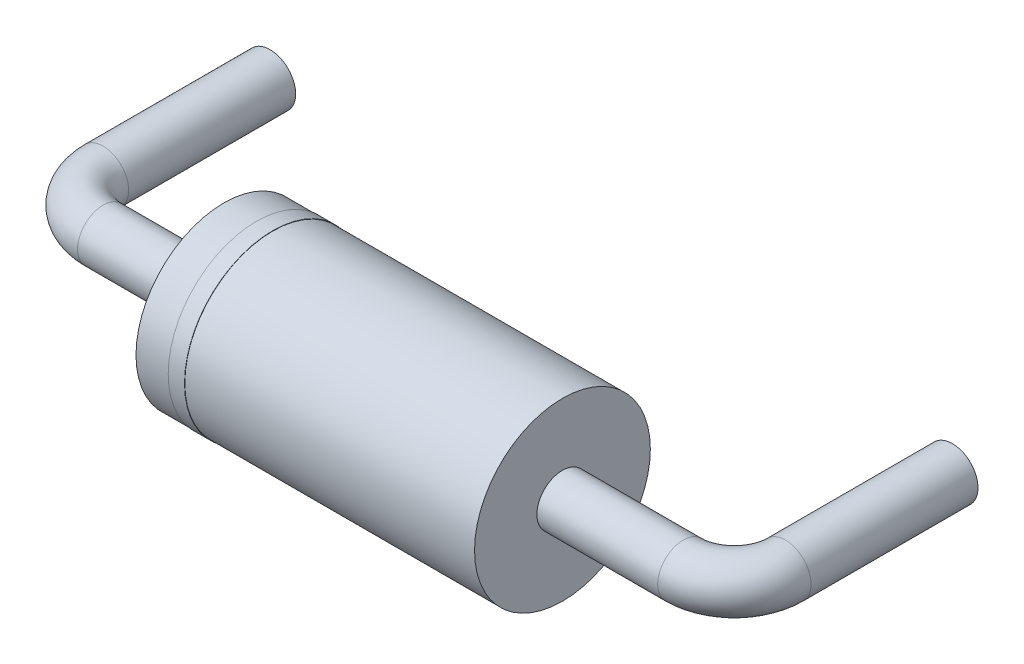
ISO-10303-21;
HEADER;
FILE_DESCRIPTION(('STEP AP214'),'2;1');
FILE_NAME('part.step','',(''),(''),'','','');
FILE_SCHEMA(('AUTOMOTIVE_DESIGN { 1 0 10303 214 1 1 1 1 }'));
ENDSEC;
DATA;
#1=APPLICATION_CONTEXT('core data for automotive mechanical design processes');
#2=APPLICATION_PROTOCOL_DEFINITION('international standard','automotive_design',2000,#1);
#3=PRODUCT_CONTEXT('',#1,'mechanical');
#4=PRODUCT('Part','Part','',(#3));
#5=PRODUCT_RELATED_PRODUCT_CATEGORY('part','',(#4));
#6=PRODUCT_DEFINITION_FORMATION('','',#4);
#7=PRODUCT_DEFINITION_CONTEXT('part definition',#1,'design');
#8=PRODUCT_DEFINITION('design','',#6,#7);
#9=PRODUCT_DEFINITION_SHAPE('','',#8);
#10=(LENGTH_UNIT() NAMED_UNIT(*) SI_UNIT(.MILLI.,.METRE.));
#11=(NAMED_UNIT(*) PLANE_ANGLE_UNIT() SI_UNIT($,.RADIAN.));
#12=(NAMED_UNIT(*) SI_UNIT($,.STERADIAN.) SOLID_ANGLE_UNIT());
#13=UNCERTAINTY_MEASURE_WITH_UNIT(LENGTH_MEASURE(1.E-05),#10,'distance_accuracy_value','');
#14=(GEOMETRIC_REPRESENTATION_CONTEXT(3) GLOBAL_UNCERTAINTY_ASSIGNED_CONTEXT((#13)) GLOBAL_UNIT_ASSIGNED_CONTEXT((#10,
#11,#12)) REPRESENTATION_CONTEXT('',''));
#15=CARTESIAN_POINT('',(0.,0.,0.));
#16=DIRECTION('',(0.,0.,1.));
#17=DIRECTION('',(1.,0.,0.));
#18=AXIS2_PLACEMENT_3D('',#15,#16,#17);
#19=CARTESIAN_POINT('',(-5.6325,0.,-2.));
#20=DIRECTION('',(0.,0.,1.));
#21=DIRECTION('',(1.,0.,0.));
#22=AXIS2_PLACEMENT_3D('',#19,#20,#21);
#23=PLANE('',#22);
#24=CARTESIAN_POINT('',(-5.24,0.,-2.));
#25=DIRECTION('',(0.,0.,-1.));
#26=DIRECTION('',(-1.,0.,0.));
#27=AXIS2_PLACEMENT_3D('',#24,#25,#26);
#28=CIRCLE('',#27,0.3925);
#29=CARTESIAN_POINT('',(-5.6325,0.,-2.));
#30=VERTEX_POINT('',#29);
#31=EDGE_CURVE('P0_E11',#30,#30,#28,.T.);
#32=ORIENTED_EDGE('',*,*,#31,.T.);
#33=EDGE_LOOP('',(#32));
#34=FACE_BOUND('',#33,.T.);
#35=ADVANCED_FACE('P0_F16',(#34),#23,.F.);
#36=CARTESIAN_POINT('',(-5.24,0.,0.565));
#37=DIRECTION('',(0.,0.,-1.));
#38=DIRECTION('',(-1.,0.,0.));
#39=AXIS2_PLACEMENT_3D('',#36,#37,#38);
#40=CYLINDRICAL_SURFACE('',#39,0.3925);
#41=DIRECTION('',(0.,0.,-1.));
#42=VECTOR('',#41,1.);
#43=CARTESIAN_POINT('',(-5.6325,0.,0.565));
#44=LINE('',#43,#42);
#45=CARTESIAN_POINT('',(-5.6325,0.,0.565));
#46=VERTEX_POINT('',#45);
#47=EDGE_CURVE('P0_E24',#46,#30,#44,.T.);
#48=ORIENTED_EDGE('',*,*,#47,.T.);
#49=ORIENTED_EDGE('',*,*,#31,.F.);
#50=ORIENTED_EDGE('',*,*,#47,.F.);
#51=CARTESIAN_POINT('',(-5.24,0.,0.565));
#52=DIRECTION('',(0.,0.,1.));
#53=DIRECTION('',(-1.,0.,0.));
#54=AXIS2_PLACEMENT_3D('',#51,#52,#53);
#55=CIRCLE('',#54,0.3925);
#56=EDGE_CURVE('P0_E68',#46,#46,#55,.T.);
#57=ORIENTED_EDGE('',*,*,#56,.F.);
#58=EDGE_LOOP('',(#48,#49,#50,#57));
#59=FACE_BOUND('',#58,.T.);
#60=ADVANCED_FACE('P0_F75',(#59),#40,.T.);
#61=CARTESIAN_POINT('',(-4.455,0.,0.565));
#62=DIRECTION('',(0.,-1.,0.));
#63=DIRECTION('',(0.,0.,1.));
#64=AXIS2_PLACEMENT_3D('',#61,#62,#63);
#65=TOROIDAL_SURFACE('',#64,0.785,0.3925);
#66=CARTESIAN_POINT('',(-4.455,0.,0.565));
#67=DIRECTION('',(0.,-1.,0.));
#68=DIRECTION('',(0.,0.,1.));
#69=AXIS2_PLACEMENT_3D('',#66,#67,#68);
#70=CIRCLE('',#69,1.1775);
#71=CARTESIAN_POINT('',(-4.455,0.,1.7425));
#72=VERTEX_POINT('',#71);
#73=EDGE_CURVE('P0_E63',#72,#46,#70,.T.);
#74=ORIENTED_EDGE('',*,*,#73,.T.);
#75=ORIENTED_EDGE('',*,*,#56,.T.);
#76=ORIENTED_EDGE('',*,*,#73,.F.);
#77=CARTESIAN_POINT('',(-4.455,0.,1.35));
#78=DIRECTION('',(-1.,0.,0.));
#79=DIRECTION('',(0.,0.,1.));
#80=AXIS2_PLACEMENT_3D('',#77,#78,#79);
#81=CIRCLE('',#80,0.3925);
#82=EDGE_CURVE('P0_E57',#72,#72,#81,.T.);
#83=ORIENTED_EDGE('',*,*,#82,.T.);
#84=EDGE_LOOP('',(#74,#75,#76,#83));
#85=FACE_BOUND('',#84,.T.);
#86=ADVANCED_FACE('P0_F74',(#85),#65,.T.);
#87=CARTESIAN_POINT('',(-2.6,0.,1.35));
#88=DIRECTION('',(-1.,0.,0.));
#89=DIRECTION('',(0.,0.,1.));
#90=AXIS2_PLACEMENT_3D('',#87,#88,#89);
#91=CYLINDRICAL_SURFACE('',#90,0.3925);
#92=DIRECTION('',(-1.,0.,0.));
#93=VECTOR('',#92,1.);
#94=CARTESIAN_POINT('',(-2.6,0.,1.7425));
#95=LINE('',#94,#93);
#96=CARTESIAN_POINT('',(-2.6,0.,1.7425));
#97=VERTEX_POINT('',#96);
#98=EDGE_CURVE('P0_E52',#97,#72,#95,.T.);
#99=ORIENTED_EDGE('',*,*,#98,.T.);
#100=ORIENTED_EDGE('',*,*,#82,.F.);
#101=ORIENTED_EDGE('',*,*,#98,.F.);
#102=CARTESIAN_POINT('',(-2.6,0.,1.35));
#103=DIRECTION('',(-1.,0.,0.));
#104=DIRECTION('',(0.,0.,1.));
#105=AXIS2_PLACEMENT_3D('',#102,#103,#104);
#106=CIRCLE('',#105,0.3925);
#107=EDGE_CURVE('P0_E55',#97,#97,#106,.T.);
#108=ORIENTED_EDGE('',*,*,#107,.T.);
#109=EDGE_LOOP('',(#99,#100,#101,#108));
#110=FACE_BOUND('',#109,.T.);
#111=ADVANCED_FACE('P0_F53',(#110),#91,.T.);
#112=CARTESIAN_POINT('',(-2.6,0.,1.7425));
#113=DIRECTION('',(1.,0.,0.));
#114=DIRECTION('',(0.,1.,0.));
#115=AXIS2_PLACEMENT_3D('',#112,#113,#114);
#116=PLANE('',#115);
#117=ORIENTED_EDGE('',*,*,#107,.F.);
#118=EDGE_LOOP('',(#117));
#119=FACE_BOUND('',#118,.T.);
#120=ADVANCED_FACE('P0_F90',(#119),#116,.T.);
#121=CLOSED_SHELL('',(#35,#60,#86,#111,#120));
#122=MANIFOLD_SOLID_BREP('P0_B1',#121);
#123=CARTESIAN_POINT('',(5.6325,0.,-2.));
#124=DIRECTION('',(0.,0.,1.));
#125=DIRECTION('',(1.,0.,0.));
#126=AXIS2_PLACEMENT_3D('',#123,#124,#125);
#127=PLANE('',#126);
#128=CARTESIAN_POINT('',(5.24,0.,-2.));
#129=DIRECTION('',(0.,0.,-1.));
#130=DIRECTION('',(1.,0.,0.));
#131=AXIS2_PLACEMENT_3D('',#128,#129,#130);
#132=CIRCLE('',#131,0.3925);
#133=CARTESIAN_POINT('',(5.6325,0.,-2.));
#134=VERTEX_POINT('',#133);
#135=EDGE_CURVE('P1_E11',#134,#134,#132,.T.);
#136=ORIENTED_EDGE('',*,*,#135,.T.);
#137=EDGE_LOOP('',(#136));
#138=FACE_BOUND('',#137,.T.);
#139=ADVANCED_FACE('P1_F16',(#138),#127,.F.);
#140=CARTESIAN_POINT('',(5.24,0.,0.565));
#141=DIRECTION('',(0.,0.,-1.));
#142=DIRECTION('',(1.,0.,0.));
#143=AXIS2_PLACEMENT_3D('',#140,#141,#142);
#144=CYLINDRICAL_SURFACE('',#143,0.3925);
#145=DIRECTION('',(0.,0.,-1.));
#146=VECTOR('',#145,1.);
#147=CARTESIAN_POINT('',(5.6325,0.,0.565));
#148=LINE('',#147,#146);
#149=CARTESIAN_POINT('',(5.6325,0.,0.565));
#150=VERTEX_POINT('',#149);
#151=EDGE_CURVE('P1_E27',#150,#134,#148,.T.);
#152=ORIENTED_EDGE('',*,*,#151,.T.);
#153=ORIENTED_EDGE('',*,*,#135,.F.);
#154=ORIENTED_EDGE('',*,*,#151,.F.);
#155=CARTESIAN_POINT('',(5.24,0.,0.565));
#156=DIRECTION('',(0.,0.,1.));
#157=DIRECTION('',(1.,0.,0.));
#158=AXIS2_PLACEMENT_3D('',#155,#156,#157);
#159=CIRCLE('',#158,0.3925);
#160=EDGE_CURVE('P1_E20',#150,#150,#159,.T.);
#161=ORIENTED_EDGE('',*,*,#160,.F.);
#162=EDGE_LOOP('',(#152,#153,#154,#161));
#163=FACE_BOUND('',#162,.T.);
#164=ADVANCED_FACE('P1_F69',(#163),#144,.T.);
#165=CARTESIAN_POINT('',(4.455,0.,0.565));
#166=DIRECTION('',(0.,1.,0.));
#167=DIRECTION('',(0.,0.,1.));
#168=AXIS2_PLACEMENT_3D('',#165,#166,#167);
#169=TOROIDAL_SURFACE('',#168,0.785,0.3925);
#170=CARTESIAN_POINT('',(4.455,0.,0.565));
#171=DIRECTION('',(0.,1.,0.));
#172=DIRECTION('',(0.,0.,1.));
#173=AXIS2_PLACEMENT_3D('',#170,#171,#172);
#174=CIRCLE('',#173,1.1775);
#175=CARTESIAN_POINT('',(4.455,0.,1.7425));
#176=VERTEX_POINT('',#175);
#177=EDGE_CURVE('P1_E50',#176,#150,#174,.T.);
#178=ORIENTED_EDGE('',*,*,#177,.T.);
#179=ORIENTED_EDGE('',*,*,#160,.T.);
#180=ORIENTED_EDGE('',*,*,#177,.F.);
#181=CARTESIAN_POINT('',(4.455,0.,1.35));
#182=DIRECTION('',(1.,0.,0.));
#183=DIRECTION('',(0.,0.,1.));
#184=AXIS2_PLACEMENT_3D('',#181,#182,#183);
#185=CIRCLE('',#184,0.3925);
#186=EDGE_CURVE('P1_E53',#176,#176,#185,.T.);
#187=ORIENTED_EDGE('',*,*,#186,.T.);
#188=EDGE_LOOP('',(#178,#179,#180,#187));
#189=FACE_BOUND('',#188,.T.);
#190=ADVANCED_FACE('P1_F51',(#189),#169,.T.);
#191=CARTESIAN_POINT('',(2.6,0.,1.35));
#192=DIRECTION('',(1.,0.,0.));
#193=DIRECTION('',(0.,0.,1.));
#194=AXIS2_PLACEMENT_3D('',#191,#192,#193);
#195=CYLINDRICAL_SURFACE('',#194,0.3925);
#196=DIRECTION('',(1.,0.,0.));
#197=VECTOR('',#196,1.);
#198=CARTESIAN_POINT('',(2.6,0.,1.7425));
#199=LINE('',#198,#197);
#200=CARTESIAN_POINT('',(2.6,0.,1.7425));
#201=VERTEX_POINT('',#200);
#202=EDGE_CURVE('P1_E62',#201,#176,#199,.T.);
#203=ORIENTED_EDGE('',*,*,#202,.T.);
#204=ORIENTED_EDGE('',*,*,#186,.F.);
#205=ORIENTED_EDGE('',*,*,#202,.F.);
#206=CARTESIAN_POINT('',(2.6,0.,1.35));
#207=DIRECTION('',(1.,0.,0.));
#208=DIRECTION('',(0.,0.,1.));
#209=AXIS2_PLACEMENT_3D('',#206,#207,#208);
#210=CIRCLE('',#209,0.3925);
#211=EDGE_CURVE('P1_E65',#201,#201,#210,.T.);
#212=ORIENTED_EDGE('',*,*,#211,.T.);
#213=EDGE_LOOP('',(#203,#204,#205,#212));
#214=FACE_BOUND('',#213,.T.);
#215=ADVANCED_FACE('P1_F77',(#214),#195,.T.);
#216=CARTESIAN_POINT('',(2.6,0.,1.7425));
#217=DIRECTION('',(-1.,0.,0.));
#218=DIRECTION('',(0.,0.,1.));
#219=AXIS2_PLACEMENT_3D('',#216,#217,#218);
#220=PLANE('',#219);
#221=ORIENTED_EDGE('',*,*,#211,.F.);
#222=EDGE_LOOP('',(#221));
#223=FACE_BOUND('',#222,.T.);
#224=ADVANCED_FACE('P1_F18',(#223),#220,.T.);
#225=CLOSED_SHELL('',(#139,#164,#190,#215,#224));
#226=MANIFOLD_SOLID_BREP('P1_B1',#225);
#227=CARTESIAN_POINT('',(-2.6,0.,1.35));
#228=DIRECTION('',(1.,0.,0.));
#229=DIRECTION('',(0.,1.,0.));
#230=AXIS2_PLACEMENT_3D('',#227,#228,#229);
#231=PLANE('',#230);
#232=CARTESIAN_POINT('',(-2.6,0.,1.35));
#233=DIRECTION('',(1.,0.,0.));
#234=DIRECTION('',(0.,0.,1.));
#235=AXIS2_PLACEMENT_3D('',#232,#233,#234);
#236=CIRCLE('',#235,1.35);
#237=CARTESIAN_POINT('',(-2.6,0.,2.7));
#238=VERTEX_POINT('',#237);
#239=EDGE_CURVE('P2_E11',#238,#238,#236,.T.);
#240=ORIENTED_EDGE('',*,*,#239,.F.);
#241=EDGE_LOOP('',(#240));
#242=FACE_BOUND('',#241,.T.);
#243=ADVANCED_FACE('P2_F16',(#242),#231,.F.);
#244=CARTESIAN_POINT('',(2.6,0.,1.35));
#245=DIRECTION('',(1.,0.,0.));
#246=DIRECTION('',(0.,1.,0.));
#247=AXIS2_PLACEMENT_3D('',#244,#245,#246);
#248=PLANE('',#247);
#249=CARTESIAN_POINT('',(2.6,0.,1.35));
#250=DIRECTION('',(1.,0.,0.));
#251=DIRECTION('',(0.,0.,1.));
#252=AXIS2_PLACEMENT_3D('',#249,#250,#251);
#253=CIRCLE('',#252,1.35);
#254=CARTESIAN_POINT('',(2.6,0.,2.7));
#255=VERTEX_POINT('',#254);
#256=EDGE_CURVE('P2_E40',#255,#255,#253,.T.);
#257=ORIENTED_EDGE('',*,*,#256,.T.);
#258=EDGE_LOOP('',(#257));
#259=FACE_BOUND('',#258,.T.);
#260=ADVANCED_FACE('P2_F43',(#259),#248,.T.);
#261=CARTESIAN_POINT('',(-2.6,0.,1.35));
#262=DIRECTION('',(1.,0.,0.));
#263=DIRECTION('',(0.,0.,1.));
#264=AXIS2_PLACEMENT_3D('',#261,#262,#263);
#265=CYLINDRICAL_SURFACE('',#264,1.35);
#266=ORIENTED_EDGE('',*,*,#256,.F.);
#267=DIRECTION('',(1.,0.,0.));
#268=VECTOR('',#267,1.);
#269=CARTESIAN_POINT('',(-2.6,0.,2.7));
#270=LINE('',#269,#268);
#271=EDGE_CURVE('P2_E19',#238,#255,#270,.T.);
#272=ORIENTED_EDGE('',*,*,#271,.F.);
#273=ORIENTED_EDGE('',*,*,#239,.T.);
#274=ORIENTED_EDGE('',*,*,#271,.T.);
#275=EDGE_LOOP('',(#266,#272,#273,#274));
#276=FACE_BOUND('',#275,.T.);
#277=ADVANCED_FACE('P2_F39',(#276),#265,.T.);
#278=CLOSED_SHELL('',(#243,#260,#277));
#279=MANIFOLD_SOLID_BREP('P2_B1',#278);
#280=CARTESIAN_POINT('',(-1.85,0.,1.35));
#281=DIRECTION('',(-1.,0.,0.));
#282=DIRECTION('',(0.,0.,1.));
#283=AXIS2_PLACEMENT_3D('',#280,#281,#282);
#284=CYLINDRICAL_SURFACE('',#283,1.355);
#285=DIRECTION('',(-1.,0.,0.));
#286=VECTOR('',#285,1.);
#287=CARTESIAN_POINT('',(-1.85,0.,2.705));
#288=LINE('',#287,#286);
#289=CARTESIAN_POINT('',(-1.85,0.,2.705));
#290=VERTEX_POINT('',#289);
#291=CARTESIAN_POINT('',(-2.1,0.,2.705));
#292=VERTEX_POINT('',#291);
#293=EDGE_CURVE('P3_E11',#290,#292,#288,.T.);
#294=ORIENTED_EDGE('',*,*,#293,.T.);
#295=CARTESIAN_POINT('',(-2.1,0.,1.35));
#296=DIRECTION('',(1.,0.,0.));
#297=DIRECTION('',(0.,0.,1.));
#298=AXIS2_PLACEMENT_3D('',#295,#296,#297);
#299=CIRCLE('',#298,1.355);
#300=EDGE_CURVE('P3_E53',#292,#292,#299,.T.);
#301=ORIENTED_EDGE('',*,*,#300,.T.);
#302=ORIENTED_EDGE('',*,*,#293,.F.);
#303=CARTESIAN_POINT('',(-1.85,0.,1.35));
#304=DIRECTION('',(1.,0.,0.));
#305=DIRECTION('',(0.,0.,1.));
#306=AXIS2_PLACEMENT_3D('',#303,#304,#305);
#307=CIRCLE('',#306,1.355);
#308=EDGE_CURVE('P3_E25',#290,#290,#307,.T.);
#309=ORIENTED_EDGE('',*,*,#308,.F.);
#310=EDGE_LOOP('',(#294,#301,#302,#309));
#311=FACE_BOUND('',#310,.T.);
#312=ADVANCED_FACE('P3_F16',(#311),#284,.T.);
#313=CARTESIAN_POINT('',(-1.85,0.,1.35));
#314=DIRECTION('',(1.,0.,0.));
#315=DIRECTION('',(0.,1.,0.));
#316=AXIS2_PLACEMENT_3D('',#313,#314,#315);
#317=PLANE('',#316);
#318=ORIENTED_EDGE('',*,*,#308,.T.);
#319=EDGE_LOOP('',(#318));
#320=FACE_BOUND('',#319,.T.);
#321=CARTESIAN_POINT('',(-1.85,0.,1.35));
#322=DIRECTION('',(1.,0.,0.));
#323=DIRECTION('',(0.,0.,1.));
#324=AXIS2_PLACEMENT_3D('',#321,#322,#323);
#325=CIRCLE('',#324,1.35);
#326=CARTESIAN_POINT('',(-1.85,0.,2.7));
#327=VERTEX_POINT('',#326);
#328=EDGE_CURVE('P3_E48',#327,#327,#325,.T.);
#329=ORIENTED_EDGE('',*,*,#328,.F.);
#330=EDGE_LOOP('',(#329));
#331=FACE_BOUND('',#330,.T.);
#332=ADVANCED_FACE('P3_F18',(#320,#331),#317,.T.);
#333=CARTESIAN_POINT('',(-2.1,0.,1.35));
#334=DIRECTION('',(1.,0.,0.));
#335=DIRECTION('',(0.,0.,1.));
#336=AXIS2_PLACEMENT_3D('',#333,#334,#335);
#337=CYLINDRICAL_SURFACE('',#336,1.35);
#338=DIRECTION('',(1.,0.,0.));
#339=VECTOR('',#338,1.);
#340=CARTESIAN_POINT('',(-2.1,0.,2.7));
#341=LINE('',#340,#339);
#342=CARTESIAN_POINT('',(-2.1,0.,2.7));
#343=VERTEX_POINT('',#342);
#344=EDGE_CURVE('P3_E58',#343,#327,#341,.T.);
#345=ORIENTED_EDGE('',*,*,#344,.T.);
#346=ORIENTED_EDGE('',*,*,#328,.T.);
#347=ORIENTED_EDGE('',*,*,#344,.F.);
#348=CARTESIAN_POINT('',(-2.1,0.,1.35));
#349=DIRECTION('',(1.,0.,0.));
#350=DIRECTION('',(0.,0.,1.));
#351=AXIS2_PLACEMENT_3D('',#348,#349,#350);
#352=CIRCLE('',#351,1.35);
#353=EDGE_CURVE('P3_E63',#343,#343,#352,.T.);
#354=ORIENTED_EDGE('',*,*,#353,.F.);
#355=EDGE_LOOP('',(#345,#346,#347,#354));
#356=FACE_BOUND('',#355,.T.);
#357=ADVANCED_FACE('P3_F78',(#356),#337,.F.);
#358=CARTESIAN_POINT('',(-2.1,0.,1.35));
#359=DIRECTION('',(1.,0.,0.));
#360=DIRECTION('',(0.,1.,0.));
#361=AXIS2_PLACEMENT_3D('',#358,#359,#360);
#362=PLANE('',#361);
#363=ORIENTED_EDGE('',*,*,#353,.T.);
#364=EDGE_LOOP('',(#363));
#365=FACE_BOUND('',#364,.T.);
#366=ORIENTED_EDGE('',*,*,#300,.F.);
#367=EDGE_LOOP('',(#366));
#368=FACE_BOUND('',#367,.T.);
#369=ADVANCED_FACE('P3_F76',(#365,#368),#362,.F.);
#370=CLOSED_SHELL('',(#312,#332,#357,#369));
#371=MANIFOLD_SOLID_BREP('P3_B1',#370);
#372=ADVANCED_BREP_SHAPE_REPRESENTATION('',(#18,#122,#226,#279,#371),#14);
#373=SHAPE_DEFINITION_REPRESENTATION(#9,#372);
ENDSEC;
END-ISO-10303-21;
